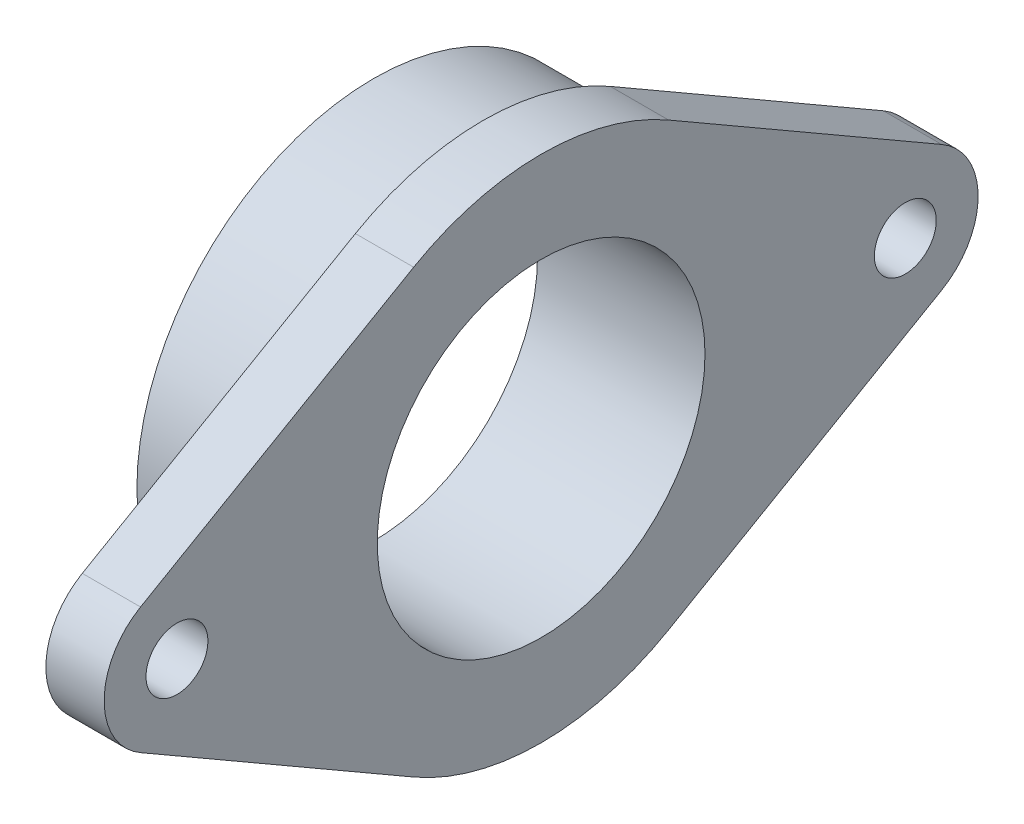
ISO-10303-21;
HEADER;
FILE_DESCRIPTION(('STEP AP214'),'2;1');
FILE_NAME('part.step','',(''),(''),'','','');
FILE_SCHEMA(('AUTOMOTIVE_DESIGN { 1 0 10303 214 1 1 1 1 }'));
ENDSEC;
DATA;
#1=APPLICATION_CONTEXT('core data for automotive mechanical design processes');
#2=APPLICATION_PROTOCOL_DEFINITION('international standard','automotive_design',2000,#1);
#3=PRODUCT_CONTEXT('',#1,'mechanical');
#4=PRODUCT('Part','Part','',(#3));
#5=PRODUCT_RELATED_PRODUCT_CATEGORY('part','',(#4));
#6=PRODUCT_DEFINITION_FORMATION('','',#4);
#7=PRODUCT_DEFINITION_CONTEXT('part definition',#1,'design');
#8=PRODUCT_DEFINITION('design','',#6,#7);
#9=PRODUCT_DEFINITION_SHAPE('','',#8);
#10=(LENGTH_UNIT() NAMED_UNIT(*) SI_UNIT(.MILLI.,.METRE.));
#11=(NAMED_UNIT(*) PLANE_ANGLE_UNIT() SI_UNIT($,.RADIAN.));
#12=(NAMED_UNIT(*) SI_UNIT($,.STERADIAN.) SOLID_ANGLE_UNIT());
#13=UNCERTAINTY_MEASURE_WITH_UNIT(LENGTH_MEASURE(1.E-05),#10,'distance_accuracy_value','');
#14=(GEOMETRIC_REPRESENTATION_CONTEXT(3) GLOBAL_UNCERTAINTY_ASSIGNED_CONTEXT((#13)) GLOBAL_UNIT_ASSIGNED_CONTEXT((#10,
#11,#12)) REPRESENTATION_CONTEXT('',''));
#15=CARTESIAN_POINT('',(0.,0.,0.));
#16=DIRECTION('',(0.,0.,1.));
#17=DIRECTION('',(1.,0.,0.));
#18=AXIS2_PLACEMENT_3D('',#15,#16,#17);
#19=CARTESIAN_POINT('',(0.,0.,0.));
#20=DIRECTION('',(1.,0.,0.));
#21=DIRECTION('',(0.,0.,-1.));
#22=AXIS2_PLACEMENT_3D('',#19,#20,#21);
#23=PLANE('',#22);
#24=CARTESIAN_POINT('',(0.,0.,0.));
#25=DIRECTION('',(1.,0.,0.));
#26=DIRECTION('',(0.,0.,-1.));
#27=AXIS2_PLACEMENT_3D('',#24,#25,#26);
#28=CIRCLE('',#27,32.5);
#29=CARTESIAN_POINT('',(0.,0.,-32.5));
#30=VERTEX_POINT('',#29);
#31=EDGE_CURVE('E36',#30,#30,#28,.T.);
#32=ORIENTED_EDGE('',*,*,#31,.F.);
#33=EDGE_LOOP('',(#32));
#34=FACE_BOUND('',#33,.T.);
#35=CARTESIAN_POINT('',(0.,0.,0.));
#36=DIRECTION('',(1.,0.,0.));
#37=DIRECTION('',(0.,0.,-1.));
#38=AXIS2_PLACEMENT_3D('',#35,#36,#37);
#39=CIRCLE('',#38,22.5);
#40=CARTESIAN_POINT('',(0.,0.,-22.5));
#41=VERTEX_POINT('',#40);
#42=EDGE_CURVE('E161',#41,#41,#39,.T.);
#43=ORIENTED_EDGE('',*,*,#42,.T.);
#44=EDGE_LOOP('',(#43));
#45=FACE_BOUND('',#44,.T.);
#46=ADVANCED_FACE('F32',(#34,#45),#23,.F.);
#47=CARTESIAN_POINT('',(15.,0.,0.));
#48=DIRECTION('',(-1.,0.,0.));
#49=DIRECTION('',(0.,0.,1.));
#50=AXIS2_PLACEMENT_3D('',#47,#48,#49);
#51=CYLINDRICAL_SURFACE('',#50,32.5);
#52=CARTESIAN_POINT('',(15.,0.,0.));
#53=DIRECTION('',(1.,0.,0.));
#54=DIRECTION('',(0.,0.,-1.));
#55=AXIS2_PLACEMENT_3D('',#52,#53,#54);
#56=CIRCLE('',#55,32.5);
#57=CARTESIAN_POINT('',(15.,0.,-32.5));
#58=VERTEX_POINT('',#57);
#59=EDGE_CURVE('E11',#58,#58,#56,.T.);
#60=ORIENTED_EDGE('',*,*,#59,.F.);
#61=EDGE_LOOP('',(#60));
#62=FACE_BOUND('',#61,.T.);
#63=ORIENTED_EDGE('',*,*,#31,.T.);
#64=EDGE_LOOP('',(#63));
#65=FACE_BOUND('',#64,.T.);
#66=ADVANCED_FACE('F34',(#62,#65),#51,.T.);
#67=CARTESIAN_POINT('',(15.,0.,0.));
#68=DIRECTION('',(-1.,0.,0.));
#69=DIRECTION('',(0.,0.,1.));
#70=AXIS2_PLACEMENT_3D('',#67,#68,#69);
#71=CYLINDRICAL_SURFACE('',#70,22.5);
#72=ORIENTED_EDGE('',*,*,#42,.F.);
#73=EDGE_LOOP('',(#72));
#74=FACE_BOUND('',#73,.T.);
#75=CARTESIAN_POINT('',(23.,0.,0.));
#76=DIRECTION('',(1.,0.,0.));
#77=DIRECTION('',(0.,0.,-1.));
#78=AXIS2_PLACEMENT_3D('',#75,#76,#77);
#79=CIRCLE('',#78,22.5);
#80=CARTESIAN_POINT('',(23.,0.,-22.5));
#81=VERTEX_POINT('',#80);
#82=EDGE_CURVE('E135',#81,#81,#79,.T.);
#83=ORIENTED_EDGE('',*,*,#82,.T.);
#84=EDGE_LOOP('',(#83));
#85=FACE_BOUND('',#84,.T.);
#86=ADVANCED_FACE('F173',(#74,#85),#71,.F.);
#87=CARTESIAN_POINT('',(23.,0.,50.));
#88=DIRECTION('',(1.,0.,0.));
#89=DIRECTION('',(0.,0.,-1.));
#90=AXIS2_PLACEMENT_3D('',#87,#88,#89);
#91=PLANE('',#90);
#92=CARTESIAN_POINT('',(23.,0.,50.));
#93=DIRECTION('',(1.,0.,0.));
#94=DIRECTION('',(0.,0.,-1.));
#95=AXIS2_PLACEMENT_3D('',#92,#93,#94);
#96=CIRCLE('',#95,4.25000000000001);
#97=CARTESIAN_POINT('',(23.,0.,45.75));
#98=VERTEX_POINT('',#97);
#99=EDGE_CURVE('E233',#98,#98,#96,.T.);
#100=ORIENTED_EDGE('',*,*,#99,.F.);
#101=EDGE_LOOP('',(#100));
#102=FACE_BOUND('',#101,.T.);
#103=CARTESIAN_POINT('',(23.,0.,50.));
#104=DIRECTION('',(1.,0.,0.));
#105=DIRECTION('',(0.,0.,-1.));
#106=AXIS2_PLACEMENT_3D('',#103,#104,#105);
#107=CIRCLE('',#106,10.);
#108=CARTESIAN_POINT('',(23.,8.66025403784439,55.));
#109=VERTEX_POINT('',#108);
#110=CARTESIAN_POINT('',(23.,-8.66025403784439,55.));
#111=VERTEX_POINT('',#110);
#112=EDGE_CURVE('E146',#109,#111,#107,.T.);
#113=ORIENTED_EDGE('',*,*,#112,.T.);
#114=DIRECTION('',(0.,-0.5,-0.866025403784439));
#115=VECTOR('',#114,1.);
#116=CARTESIAN_POINT('',(23.,-8.66025403784439,55.));
#117=LINE('',#116,#115);
#118=CARTESIAN_POINT('',(23.,-30.3108891324554,17.5));
#119=VERTEX_POINT('',#118);
#120=EDGE_CURVE('E93',#111,#119,#117,.T.);
#121=ORIENTED_EDGE('',*,*,#120,.T.);
#122=CARTESIAN_POINT('',(23.,0.,0.));
#123=DIRECTION('',(1.,0.,0.));
#124=DIRECTION('',(0.,0.,-1.));
#125=AXIS2_PLACEMENT_3D('',#122,#123,#124);
#126=CIRCLE('',#125,35.);
#127=CARTESIAN_POINT('',(23.,-30.3108891324554,-17.5));
#128=VERTEX_POINT('',#127);
#129=EDGE_CURVE('E242',#119,#128,#126,.T.);
#130=ORIENTED_EDGE('',*,*,#129,.T.);
#131=DIRECTION('',(0.,0.5,-0.866025403784439));
#132=VECTOR('',#131,1.);
#133=CARTESIAN_POINT('',(23.,-8.66025403784439,-55.));
#134=LINE('',#133,#132);
#135=CARTESIAN_POINT('',(23.,-8.66025403784439,-55.));
#136=VERTEX_POINT('',#135);
#137=EDGE_CURVE('E244',#128,#136,#134,.T.);
#138=ORIENTED_EDGE('',*,*,#137,.T.);
#139=CARTESIAN_POINT('',(23.,0.,-50.));
#140=DIRECTION('',(1.,0.,0.));
#141=DIRECTION('',(0.,0.,-1.));
#142=AXIS2_PLACEMENT_3D('',#139,#140,#141);
#143=CIRCLE('',#142,10.);
#144=CARTESIAN_POINT('',(23.,8.66025403784439,-55.));
#145=VERTEX_POINT('',#144);
#146=EDGE_CURVE('E113',#136,#145,#143,.T.);
#147=ORIENTED_EDGE('',*,*,#146,.T.);
#148=DIRECTION('',(0.,0.5,0.866025403784439));
#149=VECTOR('',#148,1.);
#150=CARTESIAN_POINT('',(23.,8.66025403784439,-55.));
#151=LINE('',#150,#149);
#152=CARTESIAN_POINT('',(23.,30.3108891324554,-17.5));
#153=VERTEX_POINT('',#152);
#154=EDGE_CURVE('E106',#145,#153,#151,.T.);
#155=ORIENTED_EDGE('',*,*,#154,.T.);
#156=CARTESIAN_POINT('',(23.,0.,0.));
#157=DIRECTION('',(1.,0.,0.));
#158=DIRECTION('',(0.,0.,-1.));
#159=AXIS2_PLACEMENT_3D('',#156,#157,#158);
#160=CIRCLE('',#159,35.);
#161=CARTESIAN_POINT('',(23.,30.3108891324554,17.5));
#162=VERTEX_POINT('',#161);
#163=EDGE_CURVE('E111',#153,#162,#160,.T.);
#164=ORIENTED_EDGE('',*,*,#163,.T.);
#165=DIRECTION('',(0.,-0.5,0.866025403784439));
#166=VECTOR('',#165,1.);
#167=CARTESIAN_POINT('',(23.,8.66025403784439,55.));
#168=LINE('',#167,#166);
#169=EDGE_CURVE('E49',#162,#109,#168,.T.);
#170=ORIENTED_EDGE('',*,*,#169,.T.);
#171=EDGE_LOOP('',(#113,#121,#130,#138,#147,#155,#164,#170));
#172=FACE_BOUND('',#171,.T.);
#173=ORIENTED_EDGE('',*,*,#82,.F.);
#174=EDGE_LOOP('',(#173));
#175=FACE_BOUND('',#174,.T.);
#176=CARTESIAN_POINT('',(23.,0.,-50.));
#177=DIRECTION('',(1.,0.,0.));
#178=DIRECTION('',(0.,0.,-1.));
#179=AXIS2_PLACEMENT_3D('',#176,#177,#178);
#180=CIRCLE('',#179,4.25000000000001);
#181=CARTESIAN_POINT('',(23.,0.,-54.25));
#182=VERTEX_POINT('',#181);
#183=EDGE_CURVE('E224',#182,#182,#180,.T.);
#184=ORIENTED_EDGE('',*,*,#183,.F.);
#185=EDGE_LOOP('',(#184));
#186=FACE_BOUND('',#185,.T.);
#187=ADVANCED_FACE('F108',(#102,#172,#175,#186),#91,.T.);
#188=CARTESIAN_POINT('',(15.,0.,50.));
#189=DIRECTION('',(1.,0.,0.));
#190=DIRECTION('',(0.,0.,-1.));
#191=AXIS2_PLACEMENT_3D('',#188,#189,#190);
#192=PLANE('',#191);
#193=ORIENTED_EDGE('',*,*,#59,.T.);
#194=EDGE_LOOP('',(#193));
#195=FACE_BOUND('',#194,.T.);
#196=CARTESIAN_POINT('',(15.,0.,50.));
#197=DIRECTION('',(1.,0.,0.));
#198=DIRECTION('',(0.,0.,-1.));
#199=AXIS2_PLACEMENT_3D('',#196,#197,#198);
#200=CIRCLE('',#199,10.);
#201=CARTESIAN_POINT('',(15.,8.66025403784439,55.));
#202=VERTEX_POINT('',#201);
#203=CARTESIAN_POINT('',(15.,-8.66025403784439,55.));
#204=VERTEX_POINT('',#203);
#205=EDGE_CURVE('E131',#202,#204,#200,.T.);
#206=ORIENTED_EDGE('',*,*,#205,.F.);
#207=DIRECTION('',(0.,-0.5,0.866025403784439));
#208=VECTOR('',#207,1.);
#209=CARTESIAN_POINT('',(15.,8.66025403784439,55.));
#210=LINE('',#209,#208);
#211=CARTESIAN_POINT('',(15.,30.3108891324554,17.5));
#212=VERTEX_POINT('',#211);
#213=EDGE_CURVE('E84',#212,#202,#210,.T.);
#214=ORIENTED_EDGE('',*,*,#213,.F.);
#215=CARTESIAN_POINT('',(15.,0.,0.));
#216=DIRECTION('',(1.,0.,0.));
#217=DIRECTION('',(0.,0.,-1.));
#218=AXIS2_PLACEMENT_3D('',#215,#216,#217);
#219=CIRCLE('',#218,35.);
#220=CARTESIAN_POINT('',(15.,30.3108891324554,-17.5));
#221=VERTEX_POINT('',#220);
#222=EDGE_CURVE('E78',#221,#212,#219,.T.);
#223=ORIENTED_EDGE('',*,*,#222,.F.);
#224=DIRECTION('',(0.,0.5,0.866025403784439));
#225=VECTOR('',#224,1.);
#226=CARTESIAN_POINT('',(15.,8.66025403784439,-55.));
#227=LINE('',#226,#225);
#228=CARTESIAN_POINT('',(15.,8.66025403784439,-55.));
#229=VERTEX_POINT('',#228);
#230=EDGE_CURVE('E121',#229,#221,#227,.T.);
#231=ORIENTED_EDGE('',*,*,#230,.F.);
#232=CARTESIAN_POINT('',(15.,0.,-50.));
#233=DIRECTION('',(1.,0.,0.));
#234=DIRECTION('',(0.,0.,-1.));
#235=AXIS2_PLACEMENT_3D('',#232,#233,#234);
#236=CIRCLE('',#235,10.);
#237=CARTESIAN_POINT('',(15.,-8.66025403784439,-55.));
#238=VERTEX_POINT('',#237);
#239=EDGE_CURVE('E141',#238,#229,#236,.T.);
#240=ORIENTED_EDGE('',*,*,#239,.F.);
#241=DIRECTION('',(0.,0.5,-0.866025403784439));
#242=VECTOR('',#241,1.);
#243=CARTESIAN_POINT('',(15.,-8.66025403784439,-55.));
#244=LINE('',#243,#242);
#245=CARTESIAN_POINT('',(15.,-30.3108891324554,-17.5));
#246=VERTEX_POINT('',#245);
#247=EDGE_CURVE('E139',#246,#238,#244,.T.);
#248=ORIENTED_EDGE('',*,*,#247,.F.);
#249=CARTESIAN_POINT('',(15.,0.,0.));
#250=DIRECTION('',(1.,0.,0.));
#251=DIRECTION('',(0.,0.,-1.));
#252=AXIS2_PLACEMENT_3D('',#249,#250,#251);
#253=CIRCLE('',#252,35.);
#254=CARTESIAN_POINT('',(15.,-30.3108891324554,17.5));
#255=VERTEX_POINT('',#254);
#256=EDGE_CURVE('E137',#255,#246,#253,.T.);
#257=ORIENTED_EDGE('',*,*,#256,.F.);
#258=DIRECTION('',(0.,-0.5,-0.866025403784439));
#259=VECTOR('',#258,1.);
#260=CARTESIAN_POINT('',(15.,-8.66025403784439,55.));
#261=LINE('',#260,#259);
#262=EDGE_CURVE('E134',#204,#255,#261,.T.);
#263=ORIENTED_EDGE('',*,*,#262,.F.);
#264=EDGE_LOOP('',(#206,#214,#223,#231,#240,#248,#257,#263));
#265=FACE_BOUND('',#264,.T.);
#266=CARTESIAN_POINT('',(15.,0.,50.));
#267=DIRECTION('',(1.,0.,0.));
#268=DIRECTION('',(0.,0.,-1.));
#269=AXIS2_PLACEMENT_3D('',#266,#267,#268);
#270=CIRCLE('',#269,4.25000000000001);
#271=CARTESIAN_POINT('',(15.,0.,45.75));
#272=VERTEX_POINT('',#271);
#273=EDGE_CURVE('E230',#272,#272,#270,.T.);
#274=ORIENTED_EDGE('',*,*,#273,.T.);
#275=EDGE_LOOP('',(#274));
#276=FACE_BOUND('',#275,.T.);
#277=CARTESIAN_POINT('',(15.,0.,-50.));
#278=DIRECTION('',(1.,0.,0.));
#279=DIRECTION('',(0.,0.,-1.));
#280=AXIS2_PLACEMENT_3D('',#277,#278,#279);
#281=CIRCLE('',#280,4.25000000000001);
#282=CARTESIAN_POINT('',(15.,0.,-54.25));
#283=VERTEX_POINT('',#282);
#284=EDGE_CURVE('E227',#283,#283,#281,.T.);
#285=ORIENTED_EDGE('',*,*,#284,.T.);
#286=EDGE_LOOP('',(#285));
#287=FACE_BOUND('',#286,.T.);
#288=ADVANCED_FACE('F183',(#195,#265,#276,#287),#192,.F.);
#289=CARTESIAN_POINT('',(23.,0.,50.));
#290=DIRECTION('',(-1.,0.,0.));
#291=DIRECTION('',(0.,0.,1.));
#292=AXIS2_PLACEMENT_3D('',#289,#290,#291);
#293=CYLINDRICAL_SURFACE('',#292,10.);
#294=ORIENTED_EDGE('',*,*,#205,.T.);
#295=DIRECTION('',(-1.,0.,0.));
#296=VECTOR('',#295,1.);
#297=CARTESIAN_POINT('',(23.,-8.66025403784439,55.));
#298=LINE('',#297,#296);
#299=EDGE_CURVE('E159',#111,#204,#298,.T.);
#300=ORIENTED_EDGE('',*,*,#299,.F.);
#301=ORIENTED_EDGE('',*,*,#112,.F.);
#302=DIRECTION('',(-1.,0.,0.));
#303=VECTOR('',#302,1.);
#304=CARTESIAN_POINT('',(23.,8.66025403784439,55.));
#305=LINE('',#304,#303);
#306=EDGE_CURVE('E127',#109,#202,#305,.T.);
#307=ORIENTED_EDGE('',*,*,#306,.T.);
#308=EDGE_LOOP('',(#294,#300,#301,#307));
#309=FACE_BOUND('',#308,.T.);
#310=ADVANCED_FACE('F179',(#309),#293,.T.);
#311=CARTESIAN_POINT('',(23.,-8.66025403784439,55.));
#312=DIRECTION('',(0.,0.866025403784439,-0.5));
#313=DIRECTION('',(0.,0.5,0.866025403784439));
#314=AXIS2_PLACEMENT_3D('',#311,#312,#313);
#315=PLANE('',#314);
#316=ORIENTED_EDGE('',*,*,#262,.T.);
#317=DIRECTION('',(-1.,0.,0.));
#318=VECTOR('',#317,1.);
#319=CARTESIAN_POINT('',(23.,-30.3108891324554,17.5));
#320=LINE('',#319,#318);
#321=EDGE_CURVE('E156',#119,#255,#320,.T.);
#322=ORIENTED_EDGE('',*,*,#321,.F.);
#323=ORIENTED_EDGE('',*,*,#120,.F.);
#324=ORIENTED_EDGE('',*,*,#299,.T.);
#325=EDGE_LOOP('',(#316,#322,#323,#324));
#326=FACE_BOUND('',#325,.T.);
#327=ADVANCED_FACE('F182',(#326),#315,.F.);
#328=CARTESIAN_POINT('',(23.,0.,0.));
#329=DIRECTION('',(-1.,0.,0.));
#330=DIRECTION('',(0.,0.,1.));
#331=AXIS2_PLACEMENT_3D('',#328,#329,#330);
#332=CYLINDRICAL_SURFACE('',#331,35.);
#333=ORIENTED_EDGE('',*,*,#256,.T.);
#334=DIRECTION('',(-1.,0.,0.));
#335=VECTOR('',#334,1.);
#336=CARTESIAN_POINT('',(23.,-30.3108891324554,-17.5));
#337=LINE('',#336,#335);
#338=EDGE_CURVE('E153',#128,#246,#337,.T.);
#339=ORIENTED_EDGE('',*,*,#338,.F.);
#340=ORIENTED_EDGE('',*,*,#129,.F.);
#341=ORIENTED_EDGE('',*,*,#321,.T.);
#342=EDGE_LOOP('',(#333,#339,#340,#341));
#343=FACE_BOUND('',#342,.T.);
#344=ADVANCED_FACE('F187',(#343),#332,.T.);
#345=CARTESIAN_POINT('',(23.,-8.66025403784439,-55.));
#346=DIRECTION('',(0.,0.866025403784439,0.5));
#347=DIRECTION('',(0.,-0.5,0.866025403784439));
#348=AXIS2_PLACEMENT_3D('',#345,#346,#347);
#349=PLANE('',#348);
#350=ORIENTED_EDGE('',*,*,#247,.T.);
#351=DIRECTION('',(-1.,0.,0.));
#352=VECTOR('',#351,1.);
#353=CARTESIAN_POINT('',(23.,-8.66025403784439,-55.));
#354=LINE('',#353,#352);
#355=EDGE_CURVE('E150',#136,#238,#354,.T.);
#356=ORIENTED_EDGE('',*,*,#355,.F.);
#357=ORIENTED_EDGE('',*,*,#137,.F.);
#358=ORIENTED_EDGE('',*,*,#338,.T.);
#359=EDGE_LOOP('',(#350,#356,#357,#358));
#360=FACE_BOUND('',#359,.T.);
#361=ADVANCED_FACE('F190',(#360),#349,.F.);
#362=CARTESIAN_POINT('',(23.,0.,-50.));
#363=DIRECTION('',(-1.,0.,0.));
#364=DIRECTION('',(0.,0.,1.));
#365=AXIS2_PLACEMENT_3D('',#362,#363,#364);
#366=CYLINDRICAL_SURFACE('',#365,10.);
#367=ORIENTED_EDGE('',*,*,#239,.T.);
#368=DIRECTION('',(-1.,0.,0.));
#369=VECTOR('',#368,1.);
#370=CARTESIAN_POINT('',(23.,8.66025403784439,-55.));
#371=LINE('',#370,#369);
#372=EDGE_CURVE('E122',#145,#229,#371,.T.);
#373=ORIENTED_EDGE('',*,*,#372,.F.);
#374=ORIENTED_EDGE('',*,*,#146,.F.);
#375=ORIENTED_EDGE('',*,*,#355,.T.);
#376=EDGE_LOOP('',(#367,#373,#374,#375));
#377=FACE_BOUND('',#376,.T.);
#378=ADVANCED_FACE('F194',(#377),#366,.T.);
#379=CARTESIAN_POINT('',(23.,8.66025403784439,-55.));
#380=DIRECTION('',(0.,-0.866025403784439,0.5));
#381=DIRECTION('',(0.,-0.5,-0.866025403784439));
#382=AXIS2_PLACEMENT_3D('',#379,#380,#381);
#383=PLANE('',#382);
#384=ORIENTED_EDGE('',*,*,#230,.T.);
#385=DIRECTION('',(-1.,0.,0.));
#386=VECTOR('',#385,1.);
#387=CARTESIAN_POINT('',(23.,30.3108891324554,-17.5));
#388=LINE('',#387,#386);
#389=EDGE_CURVE('E118',#153,#221,#388,.T.);
#390=ORIENTED_EDGE('',*,*,#389,.F.);
#391=ORIENTED_EDGE('',*,*,#154,.F.);
#392=ORIENTED_EDGE('',*,*,#372,.T.);
#393=EDGE_LOOP('',(#384,#390,#391,#392));
#394=FACE_BOUND('',#393,.T.);
#395=ADVANCED_FACE('F119',(#394),#383,.F.);
#396=CARTESIAN_POINT('',(23.,0.,0.));
#397=DIRECTION('',(-1.,0.,0.));
#398=DIRECTION('',(0.,0.,1.));
#399=AXIS2_PLACEMENT_3D('',#396,#397,#398);
#400=CYLINDRICAL_SURFACE('',#399,35.);
#401=ORIENTED_EDGE('',*,*,#222,.T.);
#402=DIRECTION('',(-1.,0.,0.));
#403=VECTOR('',#402,1.);
#404=CARTESIAN_POINT('',(23.,30.3108891324554,17.5));
#405=LINE('',#404,#403);
#406=EDGE_CURVE('E123',#162,#212,#405,.T.);
#407=ORIENTED_EDGE('',*,*,#406,.F.);
#408=ORIENTED_EDGE('',*,*,#163,.F.);
#409=ORIENTED_EDGE('',*,*,#389,.T.);
#410=EDGE_LOOP('',(#401,#407,#408,#409));
#411=FACE_BOUND('',#410,.T.);
#412=ADVANCED_FACE('F125',(#411),#400,.T.);
#413=CARTESIAN_POINT('',(23.,8.66025403784439,55.));
#414=DIRECTION('',(0.,-0.866025403784439,-0.5));
#415=DIRECTION('',(0.,0.5,-0.866025403784439));
#416=AXIS2_PLACEMENT_3D('',#413,#414,#415);
#417=PLANE('',#416);
#418=ORIENTED_EDGE('',*,*,#213,.T.);
#419=ORIENTED_EDGE('',*,*,#306,.F.);
#420=ORIENTED_EDGE('',*,*,#169,.F.);
#421=ORIENTED_EDGE('',*,*,#406,.T.);
#422=EDGE_LOOP('',(#418,#419,#420,#421));
#423=FACE_BOUND('',#422,.T.);
#424=ADVANCED_FACE('F203',(#423),#417,.F.);
#425=CARTESIAN_POINT('',(23.,0.,50.));
#426=DIRECTION('',(-1.,0.,0.));
#427=DIRECTION('',(0.,0.,1.));
#428=AXIS2_PLACEMENT_3D('',#425,#426,#427);
#429=CYLINDRICAL_SURFACE('',#428,4.25000000000001);
#430=ORIENTED_EDGE('',*,*,#99,.T.);
#431=EDGE_LOOP('',(#430));
#432=FACE_BOUND('',#431,.T.);
#433=ORIENTED_EDGE('',*,*,#273,.F.);
#434=EDGE_LOOP('',(#433));
#435=FACE_BOUND('',#434,.T.);
#436=ADVANCED_FACE('F206',(#432,#435),#429,.F.);
#437=CARTESIAN_POINT('',(23.,0.,-50.));
#438=DIRECTION('',(-1.,0.,0.));
#439=DIRECTION('',(0.,0.,1.));
#440=AXIS2_PLACEMENT_3D('',#437,#438,#439);
#441=CYLINDRICAL_SURFACE('',#440,4.25000000000001);
#442=ORIENTED_EDGE('',*,*,#183,.T.);
#443=EDGE_LOOP('',(#442));
#444=FACE_BOUND('',#443,.T.);
#445=ORIENTED_EDGE('',*,*,#284,.F.);
#446=EDGE_LOOP('',(#445));
#447=FACE_BOUND('',#446,.T.);
#448=ADVANCED_FACE('F215',(#444,#447),#441,.F.);
#449=CLOSED_SHELL('',(#46,#66,#86,#187,#288,#310,#327,#344,#361,#378,#395,#412,#424,#436,#448));
#450=MANIFOLD_SOLID_BREP('B2',#449);
#451=ADVANCED_BREP_SHAPE_REPRESENTATION('',(#18,#450),#14);
#452=SHAPE_DEFINITION_REPRESENTATION(#9,#451);
ENDSEC;
END-ISO-10303-21;
